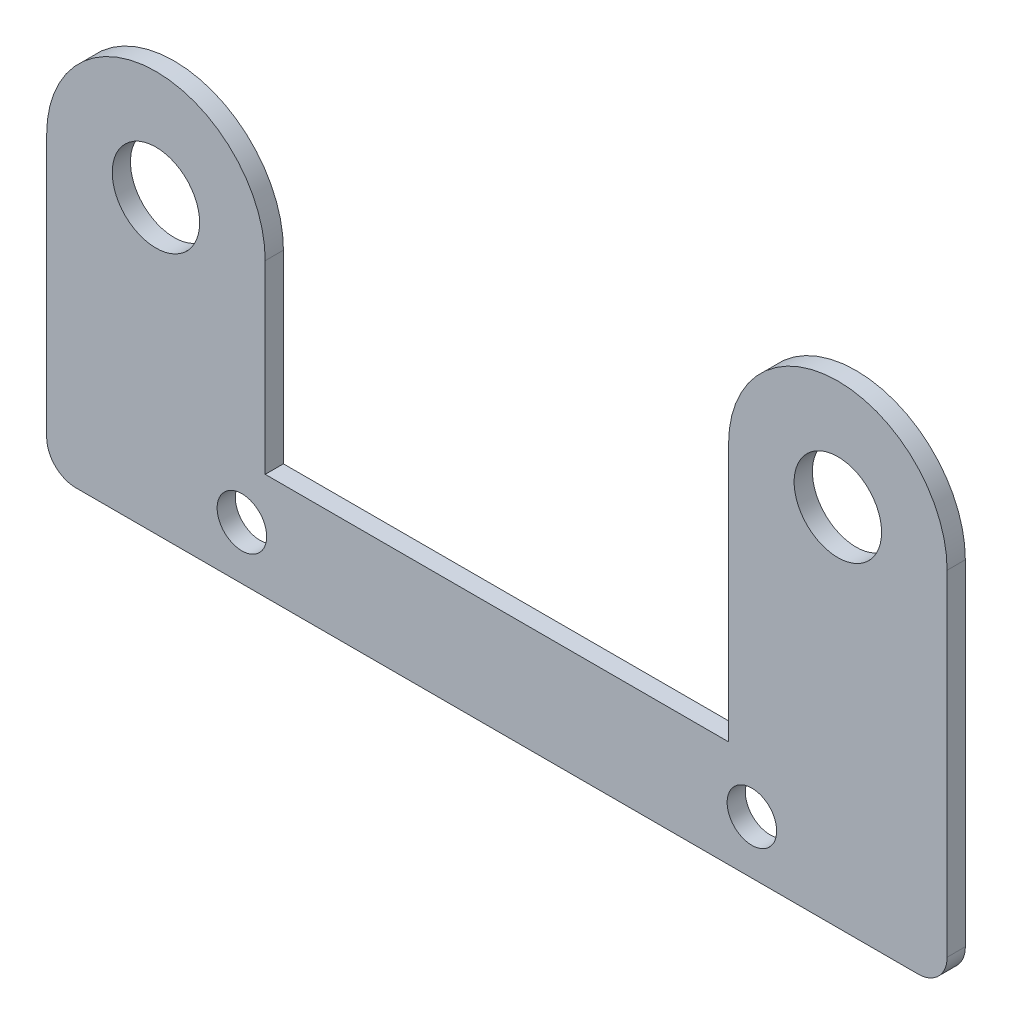
ISO-10303-21;
HEADER;
FILE_DESCRIPTION(('STEP AP214'),'2;1');
FILE_NAME('part.step','',(''),(''),'','','');
FILE_SCHEMA(('AUTOMOTIVE_DESIGN { 1 0 10303 214 1 1 1 1 }'));
ENDSEC;
DATA;
#1=APPLICATION_CONTEXT('core data for automotive mechanical design processes');
#2=APPLICATION_PROTOCOL_DEFINITION('international standard','automotive_design',2000,#1);
#3=PRODUCT_CONTEXT('',#1,'mechanical');
#4=PRODUCT('Part','Part','',(#3));
#5=PRODUCT_RELATED_PRODUCT_CATEGORY('part','',(#4));
#6=PRODUCT_DEFINITION_FORMATION('','',#4);
#7=PRODUCT_DEFINITION_CONTEXT('part definition',#1,'design');
#8=PRODUCT_DEFINITION('design','',#6,#7);
#9=PRODUCT_DEFINITION_SHAPE('','',#8);
#10=(LENGTH_UNIT() NAMED_UNIT(*) SI_UNIT(.MILLI.,.METRE.));
#11=(NAMED_UNIT(*) PLANE_ANGLE_UNIT() SI_UNIT($,.RADIAN.));
#12=(NAMED_UNIT(*) SI_UNIT($,.STERADIAN.) SOLID_ANGLE_UNIT());
#13=UNCERTAINTY_MEASURE_WITH_UNIT(LENGTH_MEASURE(1.E-05),#10,'distance_accuracy_value','');
#14=(GEOMETRIC_REPRESENTATION_CONTEXT(3) GLOBAL_UNCERTAINTY_ASSIGNED_CONTEXT((#13)) GLOBAL_UNIT_ASSIGNED_CONTEXT((#10,
#11,#12)) REPRESENTATION_CONTEXT('',''));
#15=CARTESIAN_POINT('',(0.,0.,0.));
#16=DIRECTION('',(0.,0.,1.));
#17=DIRECTION('',(1.,0.,0.));
#18=AXIS2_PLACEMENT_3D('',#15,#16,#17);
#19=CARTESIAN_POINT('',(9.525,25.4,1.5875));
#20=DIRECTION('',(0.,0.,-1.));
#21=DIRECTION('',(-1.,0.,0.));
#22=AXIS2_PLACEMENT_3D('',#19,#20,#21);
#23=PLANE('',#22);
#24=DIRECTION('',(1.,0.,0.));
#25=VECTOR('',#24,1.);
#26=CARTESIAN_POINT('',(0.,0.,1.5875));
#27=LINE('',#26,#25);
#28=CARTESIAN_POINT('',(2.54,0.,1.5875));
#29=VERTEX_POINT('',#28);
#30=CARTESIAN_POINT('',(75.946,0.,1.5875));
#31=VERTEX_POINT('',#30);
#32=EDGE_CURVE('E153',#29,#31,#27,.T.);
#33=ORIENTED_EDGE('',*,*,#32,.T.);
#34=CARTESIAN_POINT('',(75.946,2.54,1.5875));
#35=DIRECTION('',(0.,0.,-1.));
#36=DIRECTION('',(-1.,0.,0.));
#37=AXIS2_PLACEMENT_3D('',#34,#35,#36);
#38=CIRCLE('',#37,2.54);
#39=CARTESIAN_POINT('',(78.486,2.54,1.5875));
#40=VERTEX_POINT('',#39);
#41=EDGE_CURVE('E41',#31,#40,#38,.F.);
#42=ORIENTED_EDGE('',*,*,#41,.T.);
#43=DIRECTION('',(0.,1.,0.));
#44=VECTOR('',#43,1.);
#45=CARTESIAN_POINT('',(78.486,31.75,1.5875));
#46=LINE('',#45,#44);
#47=CARTESIAN_POINT('',(78.486,31.75,1.5875));
#48=VERTEX_POINT('',#47);
#49=EDGE_CURVE('E111',#40,#48,#46,.T.);
#50=ORIENTED_EDGE('',*,*,#49,.T.);
#51=CARTESIAN_POINT('',(68.961,31.75,1.5875));
#52=DIRECTION('',(0.,0.,1.));
#53=DIRECTION('',(-1.,0.,0.));
#54=AXIS2_PLACEMENT_3D('',#51,#52,#53);
#55=CIRCLE('',#54,9.525);
#56=CARTESIAN_POINT('',(59.436,31.75,1.5875));
#57=VERTEX_POINT('',#56);
#58=EDGE_CURVE('E114',#48,#57,#55,.T.);
#59=ORIENTED_EDGE('',*,*,#58,.T.);
#60=DIRECTION('',(0.,-1.,0.));
#61=VECTOR('',#60,1.);
#62=CARTESIAN_POINT('',(59.436,9.27100000000001,1.5875));
#63=LINE('',#62,#61);
#64=CARTESIAN_POINT('',(59.436,9.27100000000001,1.5875));
#65=VERTEX_POINT('',#64);
#66=EDGE_CURVE('E130',#57,#65,#63,.T.);
#67=ORIENTED_EDGE('',*,*,#66,.T.);
#68=DIRECTION('',(-1.,0.,0.));
#69=VECTOR('',#68,1.);
#70=CARTESIAN_POINT('',(19.05,9.271,1.5875));
#71=LINE('',#70,#69);
#72=CARTESIAN_POINT('',(19.05,9.271,1.5875));
#73=VERTEX_POINT('',#72);
#74=EDGE_CURVE('E191',#65,#73,#71,.T.);
#75=ORIENTED_EDGE('',*,*,#74,.T.);
#76=DIRECTION('',(0.,1.,0.));
#77=VECTOR('',#76,1.);
#78=CARTESIAN_POINT('',(19.05,25.4,1.5875));
#79=LINE('',#78,#77);
#80=CARTESIAN_POINT('',(19.05,25.4,1.5875));
#81=VERTEX_POINT('',#80);
#82=EDGE_CURVE('E206',#73,#81,#79,.T.);
#83=ORIENTED_EDGE('',*,*,#82,.T.);
#84=CARTESIAN_POINT('',(9.525,25.4,1.5875));
#85=DIRECTION('',(0.,0.,1.));
#86=DIRECTION('',(-1.,0.,0.));
#87=AXIS2_PLACEMENT_3D('',#84,#85,#86);
#88=CIRCLE('',#87,9.525);
#89=CARTESIAN_POINT('',(0.,25.4,1.5875));
#90=VERTEX_POINT('',#89);
#91=EDGE_CURVE('E204',#81,#90,#88,.T.);
#92=ORIENTED_EDGE('',*,*,#91,.T.);
#93=DIRECTION('',(0.,-1.,0.));
#94=VECTOR('',#93,1.);
#95=CARTESIAN_POINT('',(0.,25.4,1.5875));
#96=LINE('',#95,#94);
#97=CARTESIAN_POINT('',(0.,2.54,1.5875));
#98=VERTEX_POINT('',#97);
#99=EDGE_CURVE('E154',#90,#98,#96,.T.);
#100=ORIENTED_EDGE('',*,*,#99,.T.);
#101=CARTESIAN_POINT('',(2.54,2.54,1.5875));
#102=DIRECTION('',(0.,0.,-1.));
#103=DIRECTION('',(-1.,0.,0.));
#104=AXIS2_PLACEMENT_3D('',#101,#102,#103);
#105=CIRCLE('',#104,2.54);
#106=EDGE_CURVE('E151',#98,#29,#105,.F.);
#107=ORIENTED_EDGE('',*,*,#106,.T.);
#108=EDGE_LOOP('',(#33,#42,#50,#59,#67,#75,#83,#92,#100,#107));
#109=FACE_BOUND('',#108,.T.);
#110=CARTESIAN_POINT('',(17.018,4.63550000000002,1.5875));
#111=DIRECTION('',(0.,0.,1.));
#112=DIRECTION('',(1.,0.,0.));
#113=AXIS2_PLACEMENT_3D('',#110,#111,#112);
#114=CIRCLE('',#113,2.159);
#115=CARTESIAN_POINT('',(19.177,4.63550000000002,1.5875));
#116=VERTEX_POINT('',#115);
#117=EDGE_CURVE('E201',#116,#116,#114,.T.);
#118=ORIENTED_EDGE('',*,*,#117,.F.);
#119=EDGE_LOOP('',(#118));
#120=FACE_BOUND('',#119,.T.);
#121=CARTESIAN_POINT('',(61.468,4.63549999999999,1.5875));
#122=DIRECTION('',(0.,0.,1.));
#123=DIRECTION('',(1.,0.,0.));
#124=AXIS2_PLACEMENT_3D('',#121,#122,#123);
#125=CIRCLE('',#124,2.15899999999999);
#126=CARTESIAN_POINT('',(63.627,4.63549999999999,1.5875));
#127=VERTEX_POINT('',#126);
#128=EDGE_CURVE('E213',#127,#127,#125,.T.);
#129=ORIENTED_EDGE('',*,*,#128,.F.);
#130=EDGE_LOOP('',(#129));
#131=FACE_BOUND('',#130,.T.);
#132=CARTESIAN_POINT('',(9.525,25.4,1.5875));
#133=DIRECTION('',(0.,0.,1.));
#134=DIRECTION('',(1.,0.,0.));
#135=AXIS2_PLACEMENT_3D('',#132,#133,#134);
#136=CIRCLE('',#135,3.81);
#137=CARTESIAN_POINT('',(13.335,25.4,1.5875));
#138=VERTEX_POINT('',#137);
#139=EDGE_CURVE('E219',#138,#138,#136,.T.);
#140=ORIENTED_EDGE('',*,*,#139,.F.);
#141=EDGE_LOOP('',(#140));
#142=FACE_BOUND('',#141,.T.);
#143=CARTESIAN_POINT('',(68.961,31.75,1.5875));
#144=DIRECTION('',(0.,0.,1.));
#145=DIRECTION('',(1.,0.,0.));
#146=AXIS2_PLACEMENT_3D('',#143,#144,#145);
#147=CIRCLE('',#146,3.81);
#148=CARTESIAN_POINT('',(72.771,31.75,1.5875));
#149=VERTEX_POINT('',#148);
#150=EDGE_CURVE('E225',#149,#149,#147,.T.);
#151=ORIENTED_EDGE('',*,*,#150,.F.);
#152=EDGE_LOOP('',(#151));
#153=FACE_BOUND('',#152,.T.);
#154=ADVANCED_FACE('F33',(#109,#120,#131,#142,#153),#23,.F.);
#155=CARTESIAN_POINT('',(9.525,25.4,0.));
#156=DIRECTION('',(0.,0.,-1.));
#157=DIRECTION('',(-1.,0.,0.));
#158=AXIS2_PLACEMENT_3D('',#155,#156,#157);
#159=PLANE('',#158);
#160=CARTESIAN_POINT('',(9.525,25.4,0.));
#161=DIRECTION('',(0.,0.,1.));
#162=DIRECTION('',(1.,0.,0.));
#163=AXIS2_PLACEMENT_3D('',#160,#161,#162);
#164=CIRCLE('',#163,3.81);
#165=CARTESIAN_POINT('',(13.335,25.4,0.));
#166=VERTEX_POINT('',#165);
#167=EDGE_CURVE('E222',#166,#166,#164,.T.);
#168=ORIENTED_EDGE('',*,*,#167,.T.);
#169=EDGE_LOOP('',(#168));
#170=FACE_BOUND('',#169,.T.);
#171=CARTESIAN_POINT('',(17.018,4.63550000000002,0.));
#172=DIRECTION('',(0.,0.,1.));
#173=DIRECTION('',(1.,0.,0.));
#174=AXIS2_PLACEMENT_3D('',#171,#172,#173);
#175=CIRCLE('',#174,2.159);
#176=CARTESIAN_POINT('',(19.177,4.63550000000002,0.));
#177=VERTEX_POINT('',#176);
#178=EDGE_CURVE('E210',#177,#177,#175,.T.);
#179=ORIENTED_EDGE('',*,*,#178,.T.);
#180=EDGE_LOOP('',(#179));
#181=FACE_BOUND('',#180,.T.);
#182=DIRECTION('',(0.,1.,0.));
#183=VECTOR('',#182,1.);
#184=CARTESIAN_POINT('',(78.486,31.75,0.));
#185=LINE('',#184,#183);
#186=CARTESIAN_POINT('',(78.486,2.54,0.));
#187=VERTEX_POINT('',#186);
#188=CARTESIAN_POINT('',(78.486,31.75,0.));
#189=VERTEX_POINT('',#188);
#190=EDGE_CURVE('E134',#187,#189,#185,.T.);
#191=ORIENTED_EDGE('',*,*,#190,.F.);
#192=CARTESIAN_POINT('',(75.946,2.54,0.));
#193=DIRECTION('',(0.,0.,-1.));
#194=DIRECTION('',(-1.,0.,0.));
#195=AXIS2_PLACEMENT_3D('',#192,#193,#194);
#196=CIRCLE('',#195,2.54);
#197=CARTESIAN_POINT('',(75.946,0.,0.));
#198=VERTEX_POINT('',#197);
#199=EDGE_CURVE('E145',#187,#198,#196,.T.);
#200=ORIENTED_EDGE('',*,*,#199,.T.);
#201=DIRECTION('',(1.,0.,0.));
#202=VECTOR('',#201,1.);
#203=CARTESIAN_POINT('',(0.,0.,0.));
#204=LINE('',#203,#202);
#205=CARTESIAN_POINT('',(2.54,0.,0.));
#206=VERTEX_POINT('',#205);
#207=EDGE_CURVE('E121',#206,#198,#204,.T.);
#208=ORIENTED_EDGE('',*,*,#207,.F.);
#209=CARTESIAN_POINT('',(2.54,2.54,0.));
#210=DIRECTION('',(0.,0.,-1.));
#211=DIRECTION('',(-1.,0.,0.));
#212=AXIS2_PLACEMENT_3D('',#209,#210,#211);
#213=CIRCLE('',#212,2.54);
#214=CARTESIAN_POINT('',(0.,2.54,0.));
#215=VERTEX_POINT('',#214);
#216=EDGE_CURVE('E138',#206,#215,#213,.T.);
#217=ORIENTED_EDGE('',*,*,#216,.T.);
#218=DIRECTION('',(0.,-1.,0.));
#219=VECTOR('',#218,1.);
#220=CARTESIAN_POINT('',(0.,25.4,0.));
#221=LINE('',#220,#219);
#222=CARTESIAN_POINT('',(0.,25.4,0.));
#223=VERTEX_POINT('',#222);
#224=EDGE_CURVE('E166',#223,#215,#221,.T.);
#225=ORIENTED_EDGE('',*,*,#224,.F.);
#226=CARTESIAN_POINT('',(9.525,25.4,0.));
#227=DIRECTION('',(0.,0.,1.));
#228=DIRECTION('',(-1.,0.,0.));
#229=AXIS2_PLACEMENT_3D('',#226,#227,#228);
#230=CIRCLE('',#229,9.525);
#231=CARTESIAN_POINT('',(19.05,25.4,0.));
#232=VERTEX_POINT('',#231);
#233=EDGE_CURVE('E170',#232,#223,#230,.T.);
#234=ORIENTED_EDGE('',*,*,#233,.F.);
#235=DIRECTION('',(0.,1.,0.));
#236=VECTOR('',#235,1.);
#237=CARTESIAN_POINT('',(19.05,25.4,0.));
#238=LINE('',#237,#236);
#239=CARTESIAN_POINT('',(19.05,9.271,0.));
#240=VERTEX_POINT('',#239);
#241=EDGE_CURVE('E173',#240,#232,#238,.T.);
#242=ORIENTED_EDGE('',*,*,#241,.F.);
#243=DIRECTION('',(-1.,0.,0.));
#244=VECTOR('',#243,1.);
#245=CARTESIAN_POINT('',(19.05,9.271,0.));
#246=LINE('',#245,#244);
#247=CARTESIAN_POINT('',(59.436,9.27100000000001,0.));
#248=VERTEX_POINT('',#247);
#249=EDGE_CURVE('E190',#248,#240,#246,.T.);
#250=ORIENTED_EDGE('',*,*,#249,.F.);
#251=DIRECTION('',(0.,-1.,0.));
#252=VECTOR('',#251,1.);
#253=CARTESIAN_POINT('',(59.436,9.27100000000001,0.));
#254=LINE('',#253,#252);
#255=CARTESIAN_POINT('',(59.436,31.75,0.));
#256=VERTEX_POINT('',#255);
#257=EDGE_CURVE('E195',#256,#248,#254,.T.);
#258=ORIENTED_EDGE('',*,*,#257,.F.);
#259=CARTESIAN_POINT('',(68.961,31.75,0.));
#260=DIRECTION('',(0.,0.,1.));
#261=DIRECTION('',(-1.,0.,0.));
#262=AXIS2_PLACEMENT_3D('',#259,#260,#261);
#263=CIRCLE('',#262,9.525);
#264=EDGE_CURVE('E197',#189,#256,#263,.T.);
#265=ORIENTED_EDGE('',*,*,#264,.F.);
#266=EDGE_LOOP('',(#191,#200,#208,#217,#225,#234,#242,#250,#258,#265));
#267=FACE_BOUND('',#266,.T.);
#268=CARTESIAN_POINT('',(61.468,4.63549999999999,0.));
#269=DIRECTION('',(0.,0.,1.));
#270=DIRECTION('',(1.,0.,0.));
#271=AXIS2_PLACEMENT_3D('',#268,#269,#270);
#272=CIRCLE('',#271,2.15899999999999);
#273=CARTESIAN_POINT('',(63.627,4.63549999999999,0.));
#274=VERTEX_POINT('',#273);
#275=EDGE_CURVE('E216',#274,#274,#272,.T.);
#276=ORIENTED_EDGE('',*,*,#275,.T.);
#277=EDGE_LOOP('',(#276));
#278=FACE_BOUND('',#277,.T.);
#279=CARTESIAN_POINT('',(68.961,31.75,0.));
#280=DIRECTION('',(0.,0.,1.));
#281=DIRECTION('',(1.,0.,0.));
#282=AXIS2_PLACEMENT_3D('',#279,#280,#281);
#283=CIRCLE('',#282,3.81);
#284=CARTESIAN_POINT('',(72.771,31.75,0.));
#285=VERTEX_POINT('',#284);
#286=EDGE_CURVE('E228',#285,#285,#283,.T.);
#287=ORIENTED_EDGE('',*,*,#286,.T.);
#288=EDGE_LOOP('',(#287));
#289=FACE_BOUND('',#288,.T.);
#290=ADVANCED_FACE('F163',(#170,#181,#267,#278,#289),#159,.T.);
#291=CARTESIAN_POINT('',(78.486,31.75,1.5875));
#292=DIRECTION('',(-1.,0.,0.));
#293=DIRECTION('',(0.,0.,1.));
#294=AXIS2_PLACEMENT_3D('',#291,#292,#293);
#295=PLANE('',#294);
#296=ORIENTED_EDGE('',*,*,#49,.F.);
#297=DIRECTION('',(0.,0.,-1.));
#298=VECTOR('',#297,1.);
#299=CARTESIAN_POINT('',(78.486,2.54,1.5875));
#300=LINE('',#299,#298);
#301=EDGE_CURVE('E136',#40,#187,#300,.T.);
#302=ORIENTED_EDGE('',*,*,#301,.T.);
#303=ORIENTED_EDGE('',*,*,#190,.T.);
#304=DIRECTION('',(0.,0.,-1.));
#305=VECTOR('',#304,1.);
#306=CARTESIAN_POINT('',(78.486,31.75,1.5875));
#307=LINE('',#306,#305);
#308=EDGE_CURVE('E126',#48,#189,#307,.T.);
#309=ORIENTED_EDGE('',*,*,#308,.F.);
#310=EDGE_LOOP('',(#296,#302,#303,#309));
#311=FACE_BOUND('',#310,.T.);
#312=ADVANCED_FACE('F132',(#311),#295,.F.);
#313=CARTESIAN_POINT('',(68.961,31.75,1.5875));
#314=DIRECTION('',(0.,0.,-1.));
#315=DIRECTION('',(-1.,0.,0.));
#316=AXIS2_PLACEMENT_3D('',#313,#314,#315);
#317=CYLINDRICAL_SURFACE('',#316,9.525);
#318=ORIENTED_EDGE('',*,*,#264,.T.);
#319=DIRECTION('',(0.,0.,-1.));
#320=VECTOR('',#319,1.);
#321=CARTESIAN_POINT('',(59.436,31.75,1.5875));
#322=LINE('',#321,#320);
#323=EDGE_CURVE('E128',#57,#256,#322,.T.);
#324=ORIENTED_EDGE('',*,*,#323,.F.);
#325=ORIENTED_EDGE('',*,*,#58,.F.);
#326=ORIENTED_EDGE('',*,*,#308,.T.);
#327=EDGE_LOOP('',(#318,#324,#325,#326));
#328=FACE_BOUND('',#327,.T.);
#329=ADVANCED_FACE('F125',(#328),#317,.T.);
#330=CARTESIAN_POINT('',(59.436,9.27100000000001,1.5875));
#331=DIRECTION('',(1.,0.,0.));
#332=DIRECTION('',(0.,1.,0.));
#333=AXIS2_PLACEMENT_3D('',#330,#331,#332);
#334=PLANE('',#333);
#335=ORIENTED_EDGE('',*,*,#257,.T.);
#336=DIRECTION('',(0.,0.,-1.));
#337=VECTOR('',#336,1.);
#338=CARTESIAN_POINT('',(59.436,9.27100000000001,1.5875));
#339=LINE('',#338,#337);
#340=EDGE_CURVE('E140',#65,#248,#339,.T.);
#341=ORIENTED_EDGE('',*,*,#340,.F.);
#342=ORIENTED_EDGE('',*,*,#66,.F.);
#343=ORIENTED_EDGE('',*,*,#323,.T.);
#344=EDGE_LOOP('',(#335,#341,#342,#343));
#345=FACE_BOUND('',#344,.T.);
#346=ADVANCED_FACE('F262',(#345),#334,.F.);
#347=CARTESIAN_POINT('',(19.05,9.271,1.5875));
#348=DIRECTION('',(0.,-1.,0.));
#349=DIRECTION('',(1.,0.,0.));
#350=AXIS2_PLACEMENT_3D('',#347,#348,#349);
#351=PLANE('',#350);
#352=ORIENTED_EDGE('',*,*,#249,.T.);
#353=DIRECTION('',(0.,0.,-1.));
#354=VECTOR('',#353,1.);
#355=CARTESIAN_POINT('',(19.05,9.271,1.5875));
#356=LINE('',#355,#354);
#357=EDGE_CURVE('E181',#73,#240,#356,.T.);
#358=ORIENTED_EDGE('',*,*,#357,.F.);
#359=ORIENTED_EDGE('',*,*,#74,.F.);
#360=ORIENTED_EDGE('',*,*,#340,.T.);
#361=EDGE_LOOP('',(#352,#358,#359,#360));
#362=FACE_BOUND('',#361,.T.);
#363=ADVANCED_FACE('F188',(#362),#351,.F.);
#364=CARTESIAN_POINT('',(19.05,25.4,1.5875));
#365=DIRECTION('',(-1.,0.,0.));
#366=DIRECTION('',(0.,-1.,0.));
#367=AXIS2_PLACEMENT_3D('',#364,#365,#366);
#368=PLANE('',#367);
#369=ORIENTED_EDGE('',*,*,#241,.T.);
#370=DIRECTION('',(0.,0.,-1.));
#371=VECTOR('',#370,1.);
#372=CARTESIAN_POINT('',(19.05,25.4,1.5875));
#373=LINE('',#372,#371);
#374=EDGE_CURVE('E178',#81,#232,#373,.T.);
#375=ORIENTED_EDGE('',*,*,#374,.F.);
#376=ORIENTED_EDGE('',*,*,#82,.F.);
#377=ORIENTED_EDGE('',*,*,#357,.T.);
#378=EDGE_LOOP('',(#369,#375,#376,#377));
#379=FACE_BOUND('',#378,.T.);
#380=ADVANCED_FACE('F255',(#379),#368,.F.);
#381=CARTESIAN_POINT('',(9.525,25.4,1.5875));
#382=DIRECTION('',(0.,0.,-1.));
#383=DIRECTION('',(-1.,0.,0.));
#384=AXIS2_PLACEMENT_3D('',#381,#382,#383);
#385=CYLINDRICAL_SURFACE('',#384,9.525);
#386=ORIENTED_EDGE('',*,*,#233,.T.);
#387=DIRECTION('',(0.,0.,-1.));
#388=VECTOR('',#387,1.);
#389=CARTESIAN_POINT('',(0.,25.4,1.5875));
#390=LINE('',#389,#388);
#391=EDGE_CURVE('E159',#90,#223,#390,.T.);
#392=ORIENTED_EDGE('',*,*,#391,.F.);
#393=ORIENTED_EDGE('',*,*,#91,.F.);
#394=ORIENTED_EDGE('',*,*,#374,.T.);
#395=EDGE_LOOP('',(#386,#392,#393,#394));
#396=FACE_BOUND('',#395,.T.);
#397=ADVANCED_FACE('F252',(#396),#385,.T.);
#398=CARTESIAN_POINT('',(0.,25.4,1.5875));
#399=DIRECTION('',(1.,0.,0.));
#400=DIRECTION('',(0.,1.,0.));
#401=AXIS2_PLACEMENT_3D('',#398,#399,#400);
#402=PLANE('',#401);
#403=ORIENTED_EDGE('',*,*,#224,.T.);
#404=DIRECTION('',(0.,0.,-1.));
#405=VECTOR('',#404,1.);
#406=CARTESIAN_POINT('',(0.,2.54,1.5875));
#407=LINE('',#406,#405);
#408=EDGE_CURVE('E11',#215,#98,#407,.F.);
#409=ORIENTED_EDGE('',*,*,#408,.T.);
#410=ORIENTED_EDGE('',*,*,#99,.F.);
#411=ORIENTED_EDGE('',*,*,#391,.T.);
#412=EDGE_LOOP('',(#403,#409,#410,#411));
#413=FACE_BOUND('',#412,.T.);
#414=ADVANCED_FACE('F168',(#413),#402,.F.);
#415=CARTESIAN_POINT('',(0.,0.,1.5875));
#416=DIRECTION('',(0.,1.,0.));
#417=DIRECTION('',(-1.,0.,0.));
#418=AXIS2_PLACEMENT_3D('',#415,#416,#417);
#419=PLANE('',#418);
#420=ORIENTED_EDGE('',*,*,#207,.T.);
#421=DIRECTION('',(0.,0.,-1.));
#422=VECTOR('',#421,1.);
#423=CARTESIAN_POINT('',(75.946,0.,1.5875));
#424=LINE('',#423,#422);
#425=EDGE_CURVE('E54',#198,#31,#424,.F.);
#426=ORIENTED_EDGE('',*,*,#425,.T.);
#427=ORIENTED_EDGE('',*,*,#32,.F.);
#428=DIRECTION('',(0.,0.,-1.));
#429=VECTOR('',#428,1.);
#430=CARTESIAN_POINT('',(2.54,0.,1.5875));
#431=LINE('',#430,#429);
#432=EDGE_CURVE('E147',#29,#206,#431,.T.);
#433=ORIENTED_EDGE('',*,*,#432,.T.);
#434=EDGE_LOOP('',(#420,#426,#427,#433));
#435=FACE_BOUND('',#434,.T.);
#436=ADVANCED_FACE('F157',(#435),#419,.F.);
#437=CARTESIAN_POINT('',(17.018,4.63550000000002,1.5875));
#438=DIRECTION('',(0.,0.,-1.));
#439=DIRECTION('',(-1.,0.,0.));
#440=AXIS2_PLACEMENT_3D('',#437,#438,#439);
#441=CYLINDRICAL_SURFACE('',#440,2.159);
#442=ORIENTED_EDGE('',*,*,#117,.T.);
#443=EDGE_LOOP('',(#442));
#444=FACE_BOUND('',#443,.T.);
#445=ORIENTED_EDGE('',*,*,#178,.F.);
#446=EDGE_LOOP('',(#445));
#447=FACE_BOUND('',#446,.T.);
#448=ADVANCED_FACE('F245',(#444,#447),#441,.F.);
#449=CARTESIAN_POINT('',(61.468,4.63549999999999,1.5875));
#450=DIRECTION('',(0.,0.,-1.));
#451=DIRECTION('',(-1.,0.,0.));
#452=AXIS2_PLACEMENT_3D('',#449,#450,#451);
#453=CYLINDRICAL_SURFACE('',#452,2.15899999999999);
#454=ORIENTED_EDGE('',*,*,#128,.T.);
#455=EDGE_LOOP('',(#454));
#456=FACE_BOUND('',#455,.T.);
#457=ORIENTED_EDGE('',*,*,#275,.F.);
#458=EDGE_LOOP('',(#457));
#459=FACE_BOUND('',#458,.T.);
#460=ADVANCED_FACE('F283',(#456,#459),#453,.F.);
#461=CARTESIAN_POINT('',(9.525,25.4,1.5875));
#462=DIRECTION('',(0.,0.,-1.));
#463=DIRECTION('',(-1.,0.,0.));
#464=AXIS2_PLACEMENT_3D('',#461,#462,#463);
#465=CYLINDRICAL_SURFACE('',#464,3.81);
#466=ORIENTED_EDGE('',*,*,#139,.T.);
#467=EDGE_LOOP('',(#466));
#468=FACE_BOUND('',#467,.T.);
#469=ORIENTED_EDGE('',*,*,#167,.F.);
#470=EDGE_LOOP('',(#469));
#471=FACE_BOUND('',#470,.T.);
#472=ADVANCED_FACE('F275',(#468,#471),#465,.F.);
#473=CARTESIAN_POINT('',(68.961,31.75,1.5875));
#474=DIRECTION('',(0.,0.,-1.));
#475=DIRECTION('',(-1.,0.,0.));
#476=AXIS2_PLACEMENT_3D('',#473,#474,#475);
#477=CYLINDRICAL_SURFACE('',#476,3.81);
#478=ORIENTED_EDGE('',*,*,#150,.T.);
#479=EDGE_LOOP('',(#478));
#480=FACE_BOUND('',#479,.T.);
#481=ORIENTED_EDGE('',*,*,#286,.F.);
#482=EDGE_LOOP('',(#481));
#483=FACE_BOUND('',#482,.T.);
#484=ADVANCED_FACE('F234',(#480,#483),#477,.F.);
#485=CARTESIAN_POINT('',(75.946,2.54,1.5875));
#486=DIRECTION('',(0.,0.,-1.));
#487=DIRECTION('',(-1.,0.,0.));
#488=AXIS2_PLACEMENT_3D('',#485,#486,#487);
#489=CYLINDRICAL_SURFACE('',#488,2.54);
#490=ORIENTED_EDGE('',*,*,#41,.F.);
#491=ORIENTED_EDGE('',*,*,#425,.F.);
#492=ORIENTED_EDGE('',*,*,#199,.F.);
#493=ORIENTED_EDGE('',*,*,#301,.F.);
#494=EDGE_LOOP('',(#490,#491,#492,#493));
#495=FACE_BOUND('',#494,.T.);
#496=ADVANCED_FACE('F268',(#495),#489,.T.);
#497=CARTESIAN_POINT('',(2.54,2.54,1.5875));
#498=DIRECTION('',(0.,0.,-1.));
#499=DIRECTION('',(-1.,0.,0.));
#500=AXIS2_PLACEMENT_3D('',#497,#498,#499);
#501=CYLINDRICAL_SURFACE('',#500,2.54);
#502=ORIENTED_EDGE('',*,*,#106,.F.);
#503=ORIENTED_EDGE('',*,*,#408,.F.);
#504=ORIENTED_EDGE('',*,*,#216,.F.);
#505=ORIENTED_EDGE('',*,*,#432,.F.);
#506=EDGE_LOOP('',(#502,#503,#504,#505));
#507=FACE_BOUND('',#506,.T.);
#508=ADVANCED_FACE('F35',(#507),#501,.T.);
#509=CLOSED_SHELL('',(#154,#290,#312,#329,#346,#363,#380,#397,#414,#436,#448,#460,#472,#484,
#496,#508));
#510=MANIFOLD_SOLID_BREP('B2',#509);
#511=ADVANCED_BREP_SHAPE_REPRESENTATION('',(#18,#510),#14);
#512=SHAPE_DEFINITION_REPRESENTATION(#9,#511);
ENDSEC;
END-ISO-10303-21;
